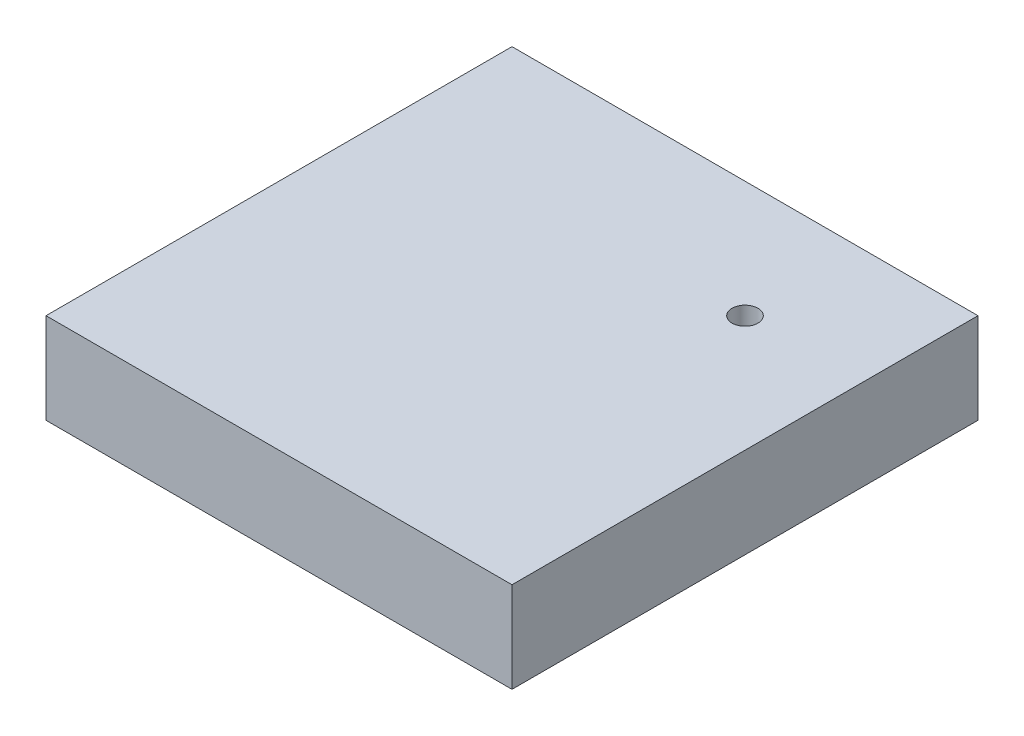
ISO-10303-21;
HEADER;
FILE_DESCRIPTION(('STEP AP214'),'2;1');
FILE_NAME('part.step','',(''),(''),'','','');
FILE_SCHEMA(('AUTOMOTIVE_DESIGN { 1 0 10303 214 1 1 1 1 }'));
ENDSEC;
DATA;
#1=APPLICATION_CONTEXT('core data for automotive mechanical design processes');
#2=APPLICATION_PROTOCOL_DEFINITION('international standard','automotive_design',2000,#1);
#3=PRODUCT_CONTEXT('',#1,'mechanical');
#4=PRODUCT('Part','Part','',(#3));
#5=PRODUCT_RELATED_PRODUCT_CATEGORY('part','',(#4));
#6=PRODUCT_DEFINITION_FORMATION('','',#4);
#7=PRODUCT_DEFINITION_CONTEXT('part definition',#1,'design');
#8=PRODUCT_DEFINITION('design','',#6,#7);
#9=PRODUCT_DEFINITION_SHAPE('','',#8);
#10=(LENGTH_UNIT() NAMED_UNIT(*) SI_UNIT(.MILLI.,.METRE.));
#11=(NAMED_UNIT(*) PLANE_ANGLE_UNIT() SI_UNIT($,.RADIAN.));
#12=(NAMED_UNIT(*) SI_UNIT($,.STERADIAN.) SOLID_ANGLE_UNIT());
#13=UNCERTAINTY_MEASURE_WITH_UNIT(LENGTH_MEASURE(1.E-05),#10,'distance_accuracy_value','');
#14=(GEOMETRIC_REPRESENTATION_CONTEXT(3) GLOBAL_UNCERTAINTY_ASSIGNED_CONTEXT((#13)) GLOBAL_UNIT_ASSIGNED_CONTEXT((#10,
#11,#12)) REPRESENTATION_CONTEXT('',''));
#15=CARTESIAN_POINT('',(0.,0.,0.));
#16=DIRECTION('',(0.,0.,1.));
#17=DIRECTION('',(1.,0.,0.));
#18=AXIS2_PLACEMENT_3D('',#15,#16,#17);
#19=CARTESIAN_POINT('',(57.15,22.225,57.15));
#20=DIRECTION('',(-1.,0.,0.));
#21=DIRECTION('',(0.,0.,1.));
#22=AXIS2_PLACEMENT_3D('',#19,#20,#21);
#23=PLANE('',#22);
#24=DIRECTION('',(0.,0.,-1.));
#25=VECTOR('',#24,1.);
#26=CARTESIAN_POINT('',(57.15,0.,57.15));
#27=LINE('',#26,#25);
#28=CARTESIAN_POINT('',(57.15,0.,57.15));
#29=VERTEX_POINT('',#28);
#30=CARTESIAN_POINT('',(57.15,0.,-57.15));
#31=VERTEX_POINT('',#30);
#32=EDGE_CURVE('E96',#29,#31,#27,.T.);
#33=ORIENTED_EDGE('',*,*,#32,.T.);
#34=DIRECTION('',(0.,-1.,0.));
#35=VECTOR('',#34,1.);
#36=CARTESIAN_POINT('',(57.15,22.225,-57.15));
#37=LINE('',#36,#35);
#38=CARTESIAN_POINT('',(57.15,22.225,-57.15));
#39=VERTEX_POINT('',#38);
#40=EDGE_CURVE('E11',#39,#31,#37,.T.);
#41=ORIENTED_EDGE('',*,*,#40,.F.);
#42=DIRECTION('',(0.,0.,-1.));
#43=VECTOR('',#42,1.);
#44=CARTESIAN_POINT('',(57.15,22.225,57.15));
#45=LINE('',#44,#43);
#46=CARTESIAN_POINT('',(57.15,22.225,57.15));
#47=VERTEX_POINT('',#46);
#48=EDGE_CURVE('E84',#47,#39,#45,.T.);
#49=ORIENTED_EDGE('',*,*,#48,.F.);
#50=DIRECTION('',(0.,-1.,0.));
#51=VECTOR('',#50,1.);
#52=CARTESIAN_POINT('',(57.15,22.225,57.15));
#53=LINE('',#52,#51);
#54=EDGE_CURVE('E92',#47,#29,#53,.T.);
#55=ORIENTED_EDGE('',*,*,#54,.T.);
#56=EDGE_LOOP('',(#33,#41,#49,#55));
#57=FACE_BOUND('',#56,.T.);
#58=ADVANCED_FACE('F33',(#57),#23,.F.);
#59=CARTESIAN_POINT('',(-57.15,22.225,-57.15));
#60=DIRECTION('',(0.,0.,1.));
#61=DIRECTION('',(1.,0.,0.));
#62=AXIS2_PLACEMENT_3D('',#59,#60,#61);
#63=PLANE('',#62);
#64=DIRECTION('',(-1.,0.,0.));
#65=VECTOR('',#64,1.);
#66=CARTESIAN_POINT('',(-57.15,0.,-57.15));
#67=LINE('',#66,#65);
#68=CARTESIAN_POINT('',(-57.15,0.,-57.15));
#69=VERTEX_POINT('',#68);
#70=EDGE_CURVE('E88',#31,#69,#67,.T.);
#71=ORIENTED_EDGE('',*,*,#70,.T.);
#72=DIRECTION('',(0.,-1.,0.));
#73=VECTOR('',#72,1.);
#74=CARTESIAN_POINT('',(-57.15,22.225,-57.15));
#75=LINE('',#74,#73);
#76=CARTESIAN_POINT('',(-57.15,22.225,-57.15));
#77=VERTEX_POINT('',#76);
#78=EDGE_CURVE('E41',#77,#69,#75,.T.);
#79=ORIENTED_EDGE('',*,*,#78,.F.);
#80=DIRECTION('',(-1.,0.,0.));
#81=VECTOR('',#80,1.);
#82=CARTESIAN_POINT('',(-57.15,22.225,-57.15));
#83=LINE('',#82,#81);
#84=EDGE_CURVE('E79',#39,#77,#83,.T.);
#85=ORIENTED_EDGE('',*,*,#84,.F.);
#86=ORIENTED_EDGE('',*,*,#40,.T.);
#87=EDGE_LOOP('',(#71,#79,#85,#86));
#88=FACE_BOUND('',#87,.T.);
#89=ADVANCED_FACE('F87',(#88),#63,.F.);
#90=CARTESIAN_POINT('',(-57.15,22.225,57.15));
#91=DIRECTION('',(1.,0.,0.));
#92=DIRECTION('',(0.,0.,-1.));
#93=AXIS2_PLACEMENT_3D('',#90,#91,#92);
#94=PLANE('',#93);
#95=DIRECTION('',(0.,0.,1.));
#96=VECTOR('',#95,1.);
#97=CARTESIAN_POINT('',(-57.15,0.,57.15));
#98=LINE('',#97,#96);
#99=CARTESIAN_POINT('',(-57.15,0.,57.15));
#100=VERTEX_POINT('',#99);
#101=EDGE_CURVE('E66',#69,#100,#98,.T.);
#102=ORIENTED_EDGE('',*,*,#101,.T.);
#103=DIRECTION('',(0.,-1.,0.));
#104=VECTOR('',#103,1.);
#105=CARTESIAN_POINT('',(-57.15,22.225,57.15));
#106=LINE('',#105,#104);
#107=CARTESIAN_POINT('',(-57.15,22.225,57.15));
#108=VERTEX_POINT('',#107);
#109=EDGE_CURVE('E89',#108,#100,#106,.T.);
#110=ORIENTED_EDGE('',*,*,#109,.F.);
#111=DIRECTION('',(0.,0.,1.));
#112=VECTOR('',#111,1.);
#113=CARTESIAN_POINT('',(-57.15,22.225,57.15));
#114=LINE('',#113,#112);
#115=EDGE_CURVE('E82',#77,#108,#114,.T.);
#116=ORIENTED_EDGE('',*,*,#115,.F.);
#117=ORIENTED_EDGE('',*,*,#78,.T.);
#118=EDGE_LOOP('',(#102,#110,#116,#117));
#119=FACE_BOUND('',#118,.T.);
#120=ADVANCED_FACE('F90',(#119),#94,.F.);
#121=CARTESIAN_POINT('',(-57.15,22.225,57.15));
#122=DIRECTION('',(0.,0.,-1.));
#123=DIRECTION('',(-1.,0.,0.));
#124=AXIS2_PLACEMENT_3D('',#121,#122,#123);
#125=PLANE('',#124);
#126=DIRECTION('',(1.,0.,0.));
#127=VECTOR('',#126,1.);
#128=CARTESIAN_POINT('',(-57.15,0.,57.15));
#129=LINE('',#128,#127);
#130=EDGE_CURVE('E72',#100,#29,#129,.T.);
#131=ORIENTED_EDGE('',*,*,#130,.T.);
#132=ORIENTED_EDGE('',*,*,#54,.F.);
#133=DIRECTION('',(1.,0.,0.));
#134=VECTOR('',#133,1.);
#135=CARTESIAN_POINT('',(-57.15,22.225,57.15));
#136=LINE('',#135,#134);
#137=EDGE_CURVE('E49',#108,#47,#136,.T.);
#138=ORIENTED_EDGE('',*,*,#137,.F.);
#139=ORIENTED_EDGE('',*,*,#109,.T.);
#140=EDGE_LOOP('',(#131,#132,#138,#139));
#141=FACE_BOUND('',#140,.T.);
#142=ADVANCED_FACE('F104',(#141),#125,.F.);
#143=CARTESIAN_POINT('',(0.,22.225,0.));
#144=DIRECTION('',(0.,-1.,0.));
#145=DIRECTION('',(0.,0.,-1.));
#146=AXIS2_PLACEMENT_3D('',#143,#144,#145);
#147=PLANE('',#146);
#148=CARTESIAN_POINT('',(28.575,22.225,-28.575));
#149=DIRECTION('',(0.,1.,0.));
#150=DIRECTION('',(0.,0.,1.));
#151=AXIS2_PLACEMENT_3D('',#148,#149,#150);
#152=CIRCLE('',#151,3.175);
#153=CARTESIAN_POINT('',(28.575,22.225,-25.4));
#154=VERTEX_POINT('',#153);
#155=EDGE_CURVE('E112',#154,#154,#152,.T.);
#156=ORIENTED_EDGE('',*,*,#155,.F.);
#157=EDGE_LOOP('',(#156));
#158=FACE_BOUND('',#157,.T.);
#159=ORIENTED_EDGE('',*,*,#48,.T.);
#160=ORIENTED_EDGE('',*,*,#84,.T.);
#161=ORIENTED_EDGE('',*,*,#115,.T.);
#162=ORIENTED_EDGE('',*,*,#137,.T.);
#163=EDGE_LOOP('',(#159,#160,#161,#162));
#164=FACE_BOUND('',#163,.T.);
#165=ADVANCED_FACE('F80',(#158,#164),#147,.F.);
#166=CARTESIAN_POINT('',(0.,0.,0.));
#167=DIRECTION('',(0.,-1.,0.));
#168=DIRECTION('',(0.,0.,-1.));
#169=AXIS2_PLACEMENT_3D('',#166,#167,#168);
#170=PLANE('',#169);
#171=CARTESIAN_POINT('',(28.575,0.,-28.575));
#172=DIRECTION('',(0.,1.,0.));
#173=DIRECTION('',(0.,0.,1.));
#174=AXIS2_PLACEMENT_3D('',#171,#172,#173);
#175=CIRCLE('',#174,3.17499999999999);
#176=CARTESIAN_POINT('',(28.575,0.,-25.4));
#177=VERTEX_POINT('',#176);
#178=EDGE_CURVE('E99',#177,#177,#175,.T.);
#179=ORIENTED_EDGE('',*,*,#178,.T.);
#180=EDGE_LOOP('',(#179));
#181=FACE_BOUND('',#180,.T.);
#182=ORIENTED_EDGE('',*,*,#32,.F.);
#183=ORIENTED_EDGE('',*,*,#130,.F.);
#184=ORIENTED_EDGE('',*,*,#101,.F.);
#185=ORIENTED_EDGE('',*,*,#70,.F.);
#186=EDGE_LOOP('',(#182,#183,#184,#185));
#187=FACE_BOUND('',#186,.T.);
#188=ADVANCED_FACE('F107',(#181,#187),#170,.T.);
#189=CARTESIAN_POINT('',(28.575,22.225,-28.575));
#190=DIRECTION('',(0.,1.,0.));
#191=DIRECTION('',(0.,0.,1.));
#192=AXIS2_PLACEMENT_3D('',#189,#190,#191);
#193=CYLINDRICAL_SURFACE('',#192,3.17499999999999);
#194=ORIENTED_EDGE('',*,*,#178,.F.);
#195=EDGE_LOOP('',(#194));
#196=FACE_BOUND('',#195,.T.);
#197=ORIENTED_EDGE('',*,*,#155,.T.);
#198=EDGE_LOOP('',(#197));
#199=FACE_BOUND('',#198,.T.);
#200=ADVANCED_FACE('F116',(#196,#199),#193,.F.);
#201=CLOSED_SHELL('',(#58,#89,#120,#142,#165,#188,#200));
#202=MANIFOLD_SOLID_BREP('B2',#201);
#203=ADVANCED_BREP_SHAPE_REPRESENTATION('',(#18,#202),#14);
#204=SHAPE_DEFINITION_REPRESENTATION(#9,#203);
ENDSEC;
END-ISO-10303-21;
